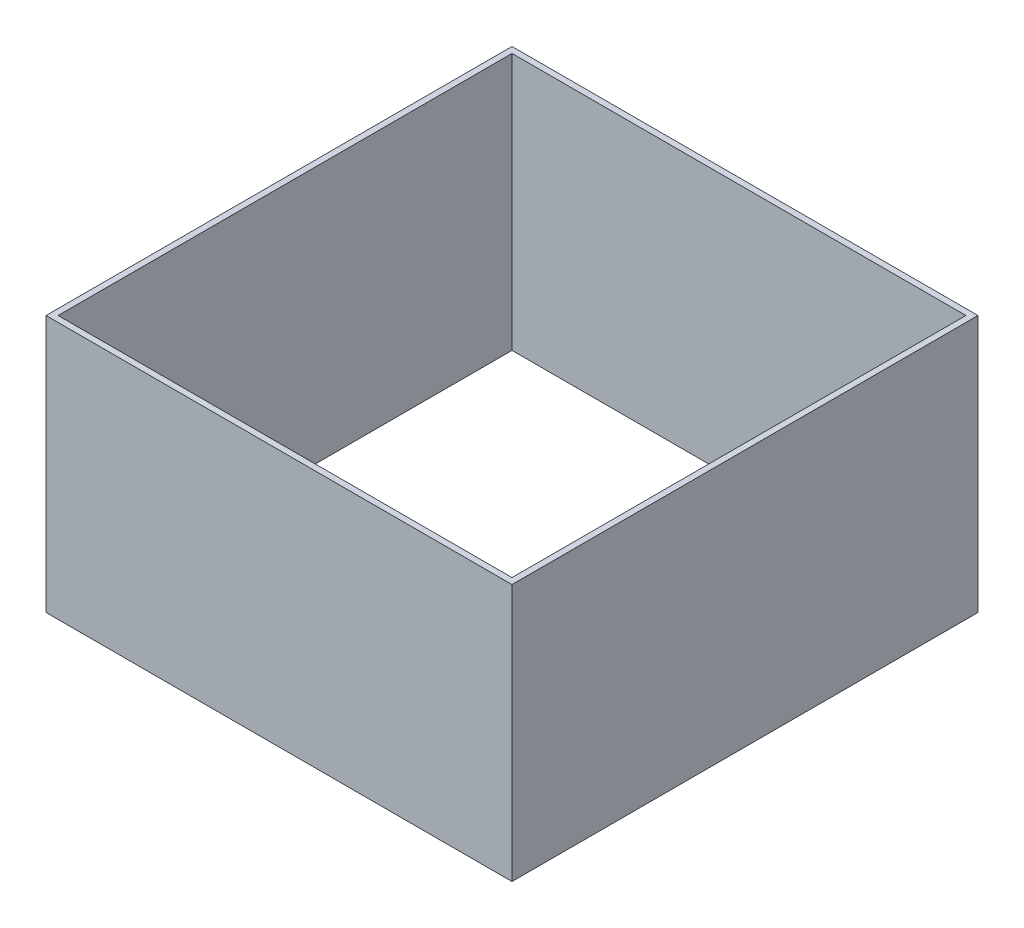
ISO-10303-21;
HEADER;
FILE_DESCRIPTION(('STEP AP214'),'2;1');
FILE_NAME('part.step','',(''),(''),'','','');
FILE_SCHEMA(('AUTOMOTIVE_DESIGN { 1 0 10303 214 1 1 1 1 }'));
ENDSEC;
DATA;
#1=APPLICATION_CONTEXT('core data for automotive mechanical design processes');
#2=APPLICATION_PROTOCOL_DEFINITION('international standard','automotive_design',2000,#1);
#3=PRODUCT_CONTEXT('',#1,'mechanical');
#4=PRODUCT('Part','Part','',(#3));
#5=PRODUCT_RELATED_PRODUCT_CATEGORY('part','',(#4));
#6=PRODUCT_DEFINITION_FORMATION('','',#4);
#7=PRODUCT_DEFINITION_CONTEXT('part definition',#1,'design');
#8=PRODUCT_DEFINITION('design','',#6,#7);
#9=PRODUCT_DEFINITION_SHAPE('','',#8);
#10=(LENGTH_UNIT() NAMED_UNIT(*) SI_UNIT(.MILLI.,.METRE.));
#11=(NAMED_UNIT(*) PLANE_ANGLE_UNIT() SI_UNIT($,.RADIAN.));
#12=(NAMED_UNIT(*) SI_UNIT($,.STERADIAN.) SOLID_ANGLE_UNIT());
#13=UNCERTAINTY_MEASURE_WITH_UNIT(LENGTH_MEASURE(1.E-05),#10,'distance_accuracy_value','');
#14=(GEOMETRIC_REPRESENTATION_CONTEXT(3) GLOBAL_UNCERTAINTY_ASSIGNED_CONTEXT((#13)) GLOBAL_UNIT_ASSIGNED_CONTEXT((#10,
#11,#12)) REPRESENTATION_CONTEXT('',''));
#15=CARTESIAN_POINT('',(0.,0.,0.));
#16=DIRECTION('',(0.,0.,1.));
#17=DIRECTION('',(1.,0.,0.));
#18=AXIS2_PLACEMENT_3D('',#15,#16,#17);
#19=CARTESIAN_POINT('',(0.,42.5,0.));
#20=DIRECTION('',(0.,-1.,0.));
#21=DIRECTION('',(0.,0.,-1.));
#22=AXIS2_PLACEMENT_3D('',#19,#20,#21);
#23=PLANE('',#22);
#24=DIRECTION('',(0.,0.,1.));
#25=VECTOR('',#24,1.);
#26=CARTESIAN_POINT('',(0.,42.5,0.));
#27=LINE('',#26,#25);
#28=CARTESIAN_POINT('',(0.,42.5,-77.));
#29=VERTEX_POINT('',#28);
#30=CARTESIAN_POINT('',(0.,42.5,0.));
#31=VERTEX_POINT('',#30);
#32=EDGE_CURVE('E153',#29,#31,#27,.T.);
#33=ORIENTED_EDGE('',*,*,#32,.T.);
#34=DIRECTION('',(1.,0.,0.));
#35=VECTOR('',#34,1.);
#36=CARTESIAN_POINT('',(0.,42.5,0.));
#37=LINE('',#36,#35);
#38=CARTESIAN_POINT('',(77.,42.5,0.));
#39=VERTEX_POINT('',#38);
#40=EDGE_CURVE('E157',#31,#39,#37,.T.);
#41=ORIENTED_EDGE('',*,*,#40,.T.);
#42=DIRECTION('',(0.,0.,-1.));
#43=VECTOR('',#42,1.);
#44=CARTESIAN_POINT('',(77.,42.5,0.));
#45=LINE('',#44,#43);
#46=CARTESIAN_POINT('',(77.,42.5,-77.));
#47=VERTEX_POINT('',#46);
#48=EDGE_CURVE('E161',#39,#47,#45,.T.);
#49=ORIENTED_EDGE('',*,*,#48,.T.);
#50=DIRECTION('',(-1.,0.,0.));
#51=VECTOR('',#50,1.);
#52=CARTESIAN_POINT('',(0.,42.5,-77.));
#53=LINE('',#52,#51);
#54=EDGE_CURVE('E164',#47,#29,#53,.T.);
#55=ORIENTED_EDGE('',*,*,#54,.T.);
#56=EDGE_LOOP('',(#33,#41,#49,#55));
#57=FACE_BOUND('',#56,.T.);
#58=DIRECTION('',(0.,0.,1.));
#59=VECTOR('',#58,1.);
#60=CARTESIAN_POINT('',(1.,42.5,-1.));
#61=LINE('',#60,#59);
#62=CARTESIAN_POINT('',(1.,42.5,-76.));
#63=VERTEX_POINT('',#62);
#64=CARTESIAN_POINT('',(1.,42.5,-1.));
#65=VERTEX_POINT('',#64);
#66=EDGE_CURVE('E105',#63,#65,#61,.T.);
#67=ORIENTED_EDGE('',*,*,#66,.F.);
#68=DIRECTION('',(-1.,0.,0.));
#69=VECTOR('',#68,1.);
#70=CARTESIAN_POINT('',(1.,42.5,-76.));
#71=LINE('',#70,#69);
#72=CARTESIAN_POINT('',(76.,42.5,-76.));
#73=VERTEX_POINT('',#72);
#74=EDGE_CURVE('E131',#73,#63,#71,.T.);
#75=ORIENTED_EDGE('',*,*,#74,.F.);
#76=DIRECTION('',(0.,0.,-1.));
#77=VECTOR('',#76,1.);
#78=CARTESIAN_POINT('',(76.,42.5,-1.));
#79=LINE('',#78,#77);
#80=CARTESIAN_POINT('',(76.,42.5,-1.));
#81=VERTEX_POINT('',#80);
#82=EDGE_CURVE('E127',#81,#73,#79,.T.);
#83=ORIENTED_EDGE('',*,*,#82,.F.);
#84=DIRECTION('',(1.,0.,0.));
#85=VECTOR('',#84,1.);
#86=CARTESIAN_POINT('',(1.,42.5,-1.));
#87=LINE('',#86,#85);
#88=EDGE_CURVE('E114',#65,#81,#87,.T.);
#89=ORIENTED_EDGE('',*,*,#88,.F.);
#90=EDGE_LOOP('',(#67,#75,#83,#89));
#91=FACE_BOUND('',#90,.T.);
#92=ADVANCED_FACE('F39',(#57,#91),#23,.F.);
#93=CARTESIAN_POINT('',(0.,0.,0.));
#94=DIRECTION('',(0.,-1.,0.));
#95=DIRECTION('',(0.,0.,-1.));
#96=AXIS2_PLACEMENT_3D('',#93,#94,#95);
#97=PLANE('',#96);
#98=DIRECTION('',(0.,0.,1.));
#99=VECTOR('',#98,1.);
#100=CARTESIAN_POINT('',(0.,0.,0.));
#101=LINE('',#100,#99);
#102=CARTESIAN_POINT('',(0.,0.,-77.));
#103=VERTEX_POINT('',#102);
#104=CARTESIAN_POINT('',(0.,0.,0.));
#105=VERTEX_POINT('',#104);
#106=EDGE_CURVE('E123',#103,#105,#101,.T.);
#107=ORIENTED_EDGE('',*,*,#106,.F.);
#108=DIRECTION('',(-1.,0.,0.));
#109=VECTOR('',#108,1.);
#110=CARTESIAN_POINT('',(0.,0.,-77.));
#111=LINE('',#110,#109);
#112=CARTESIAN_POINT('',(77.,0.,-77.));
#113=VERTEX_POINT('',#112);
#114=EDGE_CURVE('E158',#113,#103,#111,.T.);
#115=ORIENTED_EDGE('',*,*,#114,.F.);
#116=DIRECTION('',(0.,0.,-1.));
#117=VECTOR('',#116,1.);
#118=CARTESIAN_POINT('',(77.,0.,0.));
#119=LINE('',#118,#117);
#120=CARTESIAN_POINT('',(77.,0.,0.));
#121=VERTEX_POINT('',#120);
#122=EDGE_CURVE('E174',#121,#113,#119,.T.);
#123=ORIENTED_EDGE('',*,*,#122,.F.);
#124=DIRECTION('',(1.,0.,0.));
#125=VECTOR('',#124,1.);
#126=CARTESIAN_POINT('',(0.,0.,0.));
#127=LINE('',#126,#125);
#128=EDGE_CURVE('E171',#105,#121,#127,.T.);
#129=ORIENTED_EDGE('',*,*,#128,.F.);
#130=EDGE_LOOP('',(#107,#115,#123,#129));
#131=FACE_BOUND('',#130,.T.);
#132=DIRECTION('',(-1.,0.,0.));
#133=VECTOR('',#132,1.);
#134=CARTESIAN_POINT('',(1.,0.,-76.));
#135=LINE('',#134,#133);
#136=CARTESIAN_POINT('',(76.,0.,-76.));
#137=VERTEX_POINT('',#136);
#138=CARTESIAN_POINT('',(1.,0.,-76.));
#139=VERTEX_POINT('',#138);
#140=EDGE_CURVE('E115',#137,#139,#135,.T.);
#141=ORIENTED_EDGE('',*,*,#140,.T.);
#142=DIRECTION('',(0.,0.,1.));
#143=VECTOR('',#142,1.);
#144=CARTESIAN_POINT('',(1.,0.,-1.));
#145=LINE('',#144,#143);
#146=CARTESIAN_POINT('',(1.,0.,-1.));
#147=VERTEX_POINT('',#146);
#148=EDGE_CURVE('E63',#139,#147,#145,.T.);
#149=ORIENTED_EDGE('',*,*,#148,.T.);
#150=DIRECTION('',(1.,0.,0.));
#151=VECTOR('',#150,1.);
#152=CARTESIAN_POINT('',(1.,0.,-1.));
#153=LINE('',#152,#151);
#154=CARTESIAN_POINT('',(76.,0.,-1.));
#155=VERTEX_POINT('',#154);
#156=EDGE_CURVE('E121',#147,#155,#153,.T.);
#157=ORIENTED_EDGE('',*,*,#156,.T.);
#158=DIRECTION('',(0.,0.,-1.));
#159=VECTOR('',#158,1.);
#160=CARTESIAN_POINT('',(76.,0.,-1.));
#161=LINE('',#160,#159);
#162=EDGE_CURVE('E140',#155,#137,#161,.T.);
#163=ORIENTED_EDGE('',*,*,#162,.T.);
#164=EDGE_LOOP('',(#141,#149,#157,#163));
#165=FACE_BOUND('',#164,.T.);
#166=ADVANCED_FACE('F197',(#131,#165),#97,.T.);
#167=CARTESIAN_POINT('',(0.,42.5,0.));
#168=DIRECTION('',(1.,0.,0.));
#169=DIRECTION('',(0.,0.,-1.));
#170=AXIS2_PLACEMENT_3D('',#167,#168,#169);
#171=PLANE('',#170);
#172=ORIENTED_EDGE('',*,*,#106,.T.);
#173=DIRECTION('',(0.,-1.,0.));
#174=VECTOR('',#173,1.);
#175=CARTESIAN_POINT('',(0.,42.5,0.));
#176=LINE('',#175,#174);
#177=EDGE_CURVE('E11',#31,#105,#176,.T.);
#178=ORIENTED_EDGE('',*,*,#177,.F.);
#179=ORIENTED_EDGE('',*,*,#32,.F.);
#180=DIRECTION('',(0.,-1.,0.));
#181=VECTOR('',#180,1.);
#182=CARTESIAN_POINT('',(0.,42.5,-77.));
#183=LINE('',#182,#181);
#184=EDGE_CURVE('E167',#29,#103,#183,.T.);
#185=ORIENTED_EDGE('',*,*,#184,.T.);
#186=EDGE_LOOP('',(#172,#178,#179,#185));
#187=FACE_BOUND('',#186,.T.);
#188=ADVANCED_FACE('F41',(#187),#171,.F.);
#189=CARTESIAN_POINT('',(0.,42.5,0.));
#190=DIRECTION('',(0.,0.,-1.));
#191=DIRECTION('',(-1.,0.,0.));
#192=AXIS2_PLACEMENT_3D('',#189,#190,#191);
#193=PLANE('',#192);
#194=ORIENTED_EDGE('',*,*,#128,.T.);
#195=DIRECTION('',(0.,-1.,0.));
#196=VECTOR('',#195,1.);
#197=CARTESIAN_POINT('',(77.,42.5,0.));
#198=LINE('',#197,#196);
#199=EDGE_CURVE('E48',#39,#121,#198,.T.);
#200=ORIENTED_EDGE('',*,*,#199,.F.);
#201=ORIENTED_EDGE('',*,*,#40,.F.);
#202=ORIENTED_EDGE('',*,*,#177,.T.);
#203=EDGE_LOOP('',(#194,#200,#201,#202));
#204=FACE_BOUND('',#203,.T.);
#205=ADVANCED_FACE('F207',(#204),#193,.F.);
#206=CARTESIAN_POINT('',(77.,42.5,0.));
#207=DIRECTION('',(-1.,0.,0.));
#208=DIRECTION('',(0.,0.,1.));
#209=AXIS2_PLACEMENT_3D('',#206,#207,#208);
#210=PLANE('',#209);
#211=ORIENTED_EDGE('',*,*,#122,.T.);
#212=DIRECTION('',(0.,-1.,0.));
#213=VECTOR('',#212,1.);
#214=CARTESIAN_POINT('',(77.,42.5,-77.));
#215=LINE('',#214,#213);
#216=EDGE_CURVE('E182',#47,#113,#215,.T.);
#217=ORIENTED_EDGE('',*,*,#216,.F.);
#218=ORIENTED_EDGE('',*,*,#48,.F.);
#219=ORIENTED_EDGE('',*,*,#199,.T.);
#220=EDGE_LOOP('',(#211,#217,#218,#219));
#221=FACE_BOUND('',#220,.T.);
#222=ADVANCED_FACE('F191',(#221),#210,.F.);
#223=CARTESIAN_POINT('',(0.,42.5,-77.));
#224=DIRECTION('',(0.,0.,1.));
#225=DIRECTION('',(1.,0.,0.));
#226=AXIS2_PLACEMENT_3D('',#223,#224,#225);
#227=PLANE('',#226);
#228=ORIENTED_EDGE('',*,*,#114,.T.);
#229=ORIENTED_EDGE('',*,*,#184,.F.);
#230=ORIENTED_EDGE('',*,*,#54,.F.);
#231=ORIENTED_EDGE('',*,*,#216,.T.);
#232=EDGE_LOOP('',(#228,#229,#230,#231));
#233=FACE_BOUND('',#232,.T.);
#234=ADVANCED_FACE('F201',(#233),#227,.F.);
#235=CARTESIAN_POINT('',(1.,42.5,-1.));
#236=DIRECTION('',(1.,0.,0.));
#237=DIRECTION('',(0.,0.,-1.));
#238=AXIS2_PLACEMENT_3D('',#235,#236,#237);
#239=PLANE('',#238);
#240=ORIENTED_EDGE('',*,*,#148,.F.);
#241=DIRECTION('',(0.,-1.,0.));
#242=VECTOR('',#241,1.);
#243=CARTESIAN_POINT('',(1.,42.5,-76.));
#244=LINE('',#243,#242);
#245=EDGE_CURVE('E109',#63,#139,#244,.T.);
#246=ORIENTED_EDGE('',*,*,#245,.F.);
#247=ORIENTED_EDGE('',*,*,#66,.T.);
#248=DIRECTION('',(0.,-1.,0.));
#249=VECTOR('',#248,1.);
#250=CARTESIAN_POINT('',(1.,42.5,-1.));
#251=LINE('',#250,#249);
#252=EDGE_CURVE('E108',#65,#147,#251,.T.);
#253=ORIENTED_EDGE('',*,*,#252,.T.);
#254=EDGE_LOOP('',(#240,#246,#247,#253));
#255=FACE_BOUND('',#254,.T.);
#256=ADVANCED_FACE('F107',(#255),#239,.T.);
#257=CARTESIAN_POINT('',(1.,42.5,-1.));
#258=DIRECTION('',(0.,0.,-1.));
#259=DIRECTION('',(-1.,0.,0.));
#260=AXIS2_PLACEMENT_3D('',#257,#258,#259);
#261=PLANE('',#260);
#262=ORIENTED_EDGE('',*,*,#156,.F.);
#263=ORIENTED_EDGE('',*,*,#252,.F.);
#264=ORIENTED_EDGE('',*,*,#88,.T.);
#265=DIRECTION('',(0.,-1.,0.));
#266=VECTOR('',#265,1.);
#267=CARTESIAN_POINT('',(76.,42.5,-1.));
#268=LINE('',#267,#266);
#269=EDGE_CURVE('E124',#81,#155,#268,.T.);
#270=ORIENTED_EDGE('',*,*,#269,.T.);
#271=EDGE_LOOP('',(#262,#263,#264,#270));
#272=FACE_BOUND('',#271,.T.);
#273=ADVANCED_FACE('F118',(#272),#261,.T.);
#274=CARTESIAN_POINT('',(76.,42.5,-1.));
#275=DIRECTION('',(-1.,0.,0.));
#276=DIRECTION('',(0.,0.,1.));
#277=AXIS2_PLACEMENT_3D('',#274,#275,#276);
#278=PLANE('',#277);
#279=ORIENTED_EDGE('',*,*,#162,.F.);
#280=ORIENTED_EDGE('',*,*,#269,.F.);
#281=ORIENTED_EDGE('',*,*,#82,.T.);
#282=DIRECTION('',(0.,-1.,0.));
#283=VECTOR('',#282,1.);
#284=CARTESIAN_POINT('',(76.,42.5,-76.));
#285=LINE('',#284,#283);
#286=EDGE_CURVE('E55',#73,#137,#285,.T.);
#287=ORIENTED_EDGE('',*,*,#286,.T.);
#288=EDGE_LOOP('',(#279,#280,#281,#287));
#289=FACE_BOUND('',#288,.T.);
#290=ADVANCED_FACE('F230',(#289),#278,.T.);
#291=CARTESIAN_POINT('',(1.,42.5,-76.));
#292=DIRECTION('',(0.,0.,1.));
#293=DIRECTION('',(1.,0.,0.));
#294=AXIS2_PLACEMENT_3D('',#291,#292,#293);
#295=PLANE('',#294);
#296=ORIENTED_EDGE('',*,*,#140,.F.);
#297=ORIENTED_EDGE('',*,*,#286,.F.);
#298=ORIENTED_EDGE('',*,*,#74,.T.);
#299=ORIENTED_EDGE('',*,*,#245,.T.);
#300=EDGE_LOOP('',(#296,#297,#298,#299));
#301=FACE_BOUND('',#300,.T.);
#302=ADVANCED_FACE('F234',(#301),#295,.T.);
#303=CLOSED_SHELL('',(#92,#166,#188,#205,#222,#234,#256,#273,#290,#302));
#304=MANIFOLD_SOLID_BREP('B2',#303);
#305=ADVANCED_BREP_SHAPE_REPRESENTATION('',(#18,#304),#14);
#306=SHAPE_DEFINITION_REPRESENTATION(#9,#305);
ENDSEC;
END-ISO-10303-21;
